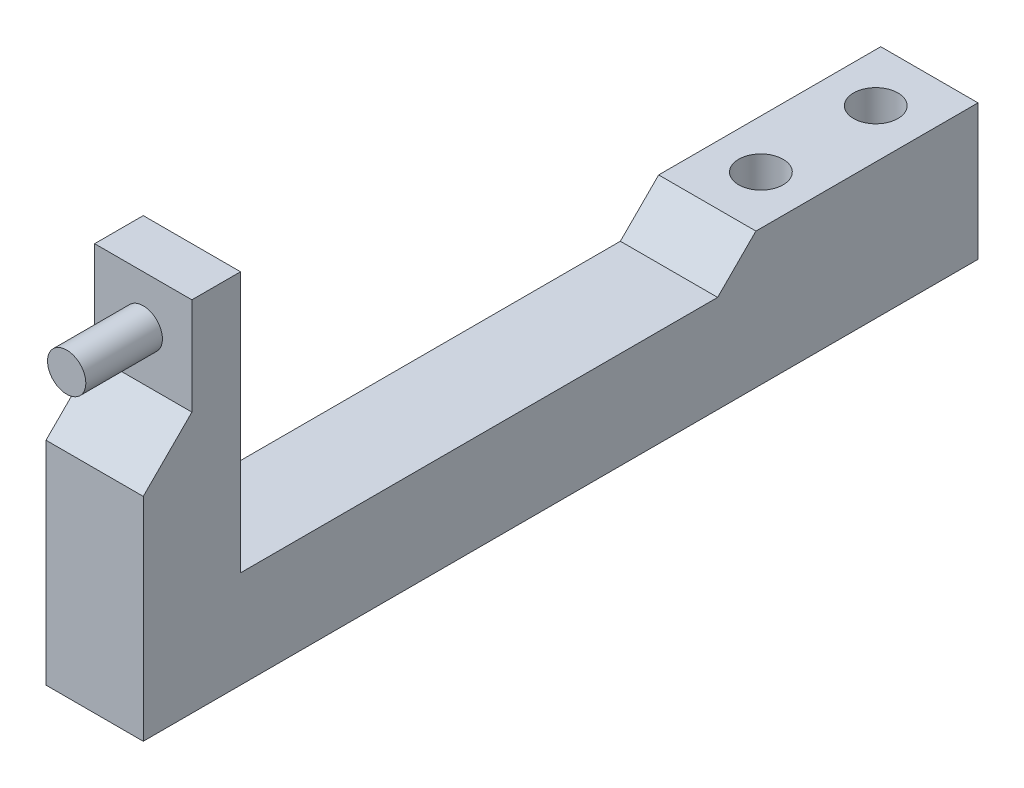
ISO-10303-21;
HEADER;
FILE_DESCRIPTION(('STEP AP214'),'2;1');
FILE_NAME('part.step','',(''),(''),'','','');
FILE_SCHEMA(('AUTOMOTIVE_DESIGN { 1 0 10303 214 1 1 1 1 }'));
ENDSEC;
DATA;
#1=APPLICATION_CONTEXT('core data for automotive mechanical design processes');
#2=APPLICATION_PROTOCOL_DEFINITION('international standard','automotive_design',2000,#1);
#3=PRODUCT_CONTEXT('',#1,'mechanical');
#4=PRODUCT('Part','Part','',(#3));
#5=PRODUCT_RELATED_PRODUCT_CATEGORY('part','',(#4));
#6=PRODUCT_DEFINITION_FORMATION('','',#4);
#7=PRODUCT_DEFINITION_CONTEXT('part definition',#1,'design');
#8=PRODUCT_DEFINITION('design','',#6,#7);
#9=PRODUCT_DEFINITION_SHAPE('','',#8);
#10=(LENGTH_UNIT() NAMED_UNIT(*) SI_UNIT(.MILLI.,.METRE.));
#11=(NAMED_UNIT(*) PLANE_ANGLE_UNIT() SI_UNIT($,.RADIAN.));
#12=(NAMED_UNIT(*) SI_UNIT($,.STERADIAN.) SOLID_ANGLE_UNIT());
#13=UNCERTAINTY_MEASURE_WITH_UNIT(LENGTH_MEASURE(1.E-05),#10,'distance_accuracy_value','');
#14=(GEOMETRIC_REPRESENTATION_CONTEXT(3) GLOBAL_UNCERTAINTY_ASSIGNED_CONTEXT((#13)) GLOBAL_UNIT_ASSIGNED_CONTEXT((#10,
#11,#12)) REPRESENTATION_CONTEXT('',''));
#15=CARTESIAN_POINT('',(0.,0.,0.));
#16=DIRECTION('',(0.,0.,1.));
#17=DIRECTION('',(1.,0.,0.));
#18=AXIS2_PLACEMENT_3D('',#15,#16,#17);
#19=CARTESIAN_POINT('',(0.,46.75,0.));
#20=DIRECTION('',(0.,-1.,0.));
#21=DIRECTION('',(0.,0.,-1.));
#22=AXIS2_PLACEMENT_3D('',#19,#20,#21);
#23=PLANE('',#22);
#24=DIRECTION('',(1.,0.,0.));
#25=VECTOR('',#24,1.);
#26=CARTESIAN_POINT('',(-6.35,46.75,48.15));
#27=LINE('',#26,#25);
#28=CARTESIAN_POINT('',(-6.35,46.75,48.15));
#29=VERTEX_POINT('',#28);
#30=CARTESIAN_POINT('',(6.35,46.75,48.15));
#31=VERTEX_POINT('',#30);
#32=EDGE_CURVE('E144',#29,#31,#27,.T.);
#33=ORIENTED_EDGE('',*,*,#32,.T.);
#34=DIRECTION('',(0.,0.,-1.));
#35=VECTOR('',#34,1.);
#36=CARTESIAN_POINT('',(6.35,46.75,54.5));
#37=LINE('',#36,#35);
#38=CARTESIAN_POINT('',(6.35,46.75,41.8));
#39=VERTEX_POINT('',#38);
#40=EDGE_CURVE('E142',#31,#39,#37,.T.);
#41=ORIENTED_EDGE('',*,*,#40,.T.);
#42=DIRECTION('',(-1.,0.,0.));
#43=VECTOR('',#42,1.);
#44=CARTESIAN_POINT('',(-6.35,46.75,41.8));
#45=LINE('',#44,#43);
#46=CARTESIAN_POINT('',(-6.35,46.75,41.8));
#47=VERTEX_POINT('',#46);
#48=EDGE_CURVE('E163',#39,#47,#45,.T.);
#49=ORIENTED_EDGE('',*,*,#48,.T.);
#50=DIRECTION('',(0.,0.,1.));
#51=VECTOR('',#50,1.);
#52=CARTESIAN_POINT('',(-6.35,46.75,54.5));
#53=LINE('',#52,#51);
#54=EDGE_CURVE('E157',#47,#29,#53,.T.);
#55=ORIENTED_EDGE('',*,*,#54,.T.);
#56=EDGE_LOOP('',(#33,#41,#49,#55));
#57=FACE_BOUND('',#56,.T.);
#58=ADVANCED_FACE('F47',(#57),#23,.F.);
#59=CARTESIAN_POINT('',(0.,12.7,0.));
#60=DIRECTION('',(0.,-1.,0.));
#61=DIRECTION('',(0.,0.,-1.));
#62=AXIS2_PLACEMENT_3D('',#59,#60,#61);
#63=PLANE('',#62);
#64=DIRECTION('',(-1.,0.,0.));
#65=VECTOR('',#64,1.);
#66=CARTESIAN_POINT('',(-6.35,12.7,41.8));
#67=LINE('',#66,#65);
#68=CARTESIAN_POINT('',(6.35,12.7,41.8));
#69=VERTEX_POINT('',#68);
#70=CARTESIAN_POINT('',(-6.35,12.7,41.8));
#71=VERTEX_POINT('',#70);
#72=EDGE_CURVE('E137',#69,#71,#67,.T.);
#73=ORIENTED_EDGE('',*,*,#72,.F.);
#74=DIRECTION('',(0.,0.,-1.));
#75=VECTOR('',#74,1.);
#76=CARTESIAN_POINT('',(6.35,12.7,54.5));
#77=LINE('',#76,#75);
#78=CARTESIAN_POINT('',(6.35,12.7,-20.5));
#79=VERTEX_POINT('',#78);
#80=EDGE_CURVE('E234',#69,#79,#77,.T.);
#81=ORIENTED_EDGE('',*,*,#80,.T.);
#82=DIRECTION('',(-1.,0.,0.));
#83=VECTOR('',#82,1.);
#84=CARTESIAN_POINT('',(-6.35,12.7,-20.5));
#85=LINE('',#84,#83);
#86=CARTESIAN_POINT('',(-6.35,12.7,-20.5));
#87=VERTEX_POINT('',#86);
#88=EDGE_CURVE('E268',#79,#87,#85,.T.);
#89=ORIENTED_EDGE('',*,*,#88,.T.);
#90=DIRECTION('',(0.,0.,1.));
#91=VECTOR('',#90,1.);
#92=CARTESIAN_POINT('',(-6.35,12.7,54.5));
#93=LINE('',#92,#91);
#94=EDGE_CURVE('E237',#87,#71,#93,.T.);
#95=ORIENTED_EDGE('',*,*,#94,.T.);
#96=EDGE_LOOP('',(#73,#81,#89,#95));
#97=FACE_BOUND('',#96,.T.);
#98=ADVANCED_FACE('F306',(#97),#63,.F.);
#99=CARTESIAN_POINT('',(6.35,12.7,54.5));
#100=DIRECTION('',(-1.,0.,0.));
#101=DIRECTION('',(0.,0.,1.));
#102=AXIS2_PLACEMENT_3D('',#99,#100,#101);
#103=PLANE('',#102);
#104=DIRECTION('',(0.,-1.,0.));
#105=VECTOR('',#104,1.);
#106=CARTESIAN_POINT('',(6.35,46.75,48.15));
#107=LINE('',#106,#105);
#108=CARTESIAN_POINT('',(6.35,34.05,48.15));
#109=VERTEX_POINT('',#108);
#110=EDGE_CURVE('E132',#31,#109,#107,.T.);
#111=ORIENTED_EDGE('',*,*,#110,.T.);
#112=DIRECTION('',(0.,0.707106781186548,-0.707106781186547));
#113=VECTOR('',#112,1.);
#114=CARTESIAN_POINT('',(6.35,34.05,48.15));
#115=LINE('',#114,#113);
#116=CARTESIAN_POINT('',(6.35,27.7,54.5));
#117=VERTEX_POINT('',#116);
#118=EDGE_CURVE('E71',#109,#117,#115,.F.);
#119=ORIENTED_EDGE('',*,*,#118,.T.);
#120=DIRECTION('',(0.,-1.,0.));
#121=VECTOR('',#120,1.);
#122=CARTESIAN_POINT('',(6.35,12.7,54.5));
#123=LINE('',#122,#121);
#124=CARTESIAN_POINT('',(6.35,0.,54.5));
#125=VERTEX_POINT('',#124);
#126=EDGE_CURVE('E241',#117,#125,#123,.T.);
#127=ORIENTED_EDGE('',*,*,#126,.T.);
#128=DIRECTION('',(0.,0.,-1.));
#129=VECTOR('',#128,1.);
#130=CARTESIAN_POINT('',(6.35,0.,54.5));
#131=LINE('',#130,#129);
#132=CARTESIAN_POINT('',(6.35,0.,-54.5));
#133=VERTEX_POINT('',#132);
#134=EDGE_CURVE('E233',#125,#133,#131,.T.);
#135=ORIENTED_EDGE('',*,*,#134,.T.);
#136=DIRECTION('',(0.,-1.,0.));
#137=VECTOR('',#136,1.);
#138=CARTESIAN_POINT('',(6.35,12.7,-54.5));
#139=LINE('',#138,#137);
#140=CARTESIAN_POINT('',(6.34999999999994,17.7,-54.5));
#141=VERTEX_POINT('',#140);
#142=EDGE_CURVE('E264',#141,#133,#139,.T.);
#143=ORIENTED_EDGE('',*,*,#142,.F.);
#144=DIRECTION('',(0.,0.,-1.));
#145=VECTOR('',#144,1.);
#146=CARTESIAN_POINT('',(6.34999999999994,17.7,-54.5));
#147=LINE('',#146,#145);
#148=CARTESIAN_POINT('',(6.34999999999995,17.7,-25.5));
#149=VERTEX_POINT('',#148);
#150=EDGE_CURVE('E225',#149,#141,#147,.T.);
#151=ORIENTED_EDGE('',*,*,#150,.F.);
#152=DIRECTION('',(0.,0.707106781186551,-0.707106781186544));
#153=VECTOR('',#152,1.);
#154=CARTESIAN_POINT('',(6.35,-24.8,16.9999999999997));
#155=LINE('',#154,#153);
#156=EDGE_CURVE('E271',#149,#79,#155,.F.);
#157=ORIENTED_EDGE('',*,*,#156,.T.);
#158=ORIENTED_EDGE('',*,*,#80,.F.);
#159=DIRECTION('',(0.,-1.,0.));
#160=VECTOR('',#159,1.);
#161=CARTESIAN_POINT('',(6.35,46.75,41.8));
#162=LINE('',#161,#160);
#163=EDGE_CURVE('E173',#39,#69,#162,.T.);
#164=ORIENTED_EDGE('',*,*,#163,.F.);
#165=ORIENTED_EDGE('',*,*,#40,.F.);
#166=EDGE_LOOP('',(#111,#119,#127,#135,#143,#151,#157,#158,#164,#165));
#167=FACE_BOUND('',#166,.T.);
#168=ADVANCED_FACE('F140',(#167),#103,.F.);
#169=CARTESIAN_POINT('',(-6.35,12.7,-54.5));
#170=DIRECTION('',(0.,0.,1.));
#171=DIRECTION('',(1.,0.,0.));
#172=AXIS2_PLACEMENT_3D('',#169,#170,#171);
#173=PLANE('',#172);
#174=DIRECTION('',(-1.,0.,0.));
#175=VECTOR('',#174,1.);
#176=CARTESIAN_POINT('',(-6.35,0.,-54.5));
#177=LINE('',#176,#175);
#178=CARTESIAN_POINT('',(-6.35,0.,-54.5));
#179=VERTEX_POINT('',#178);
#180=EDGE_CURVE('E245',#133,#179,#177,.T.);
#181=ORIENTED_EDGE('',*,*,#180,.T.);
#182=DIRECTION('',(0.,-1.,0.));
#183=VECTOR('',#182,1.);
#184=CARTESIAN_POINT('',(-6.35,12.7,-54.5));
#185=LINE('',#184,#183);
#186=CARTESIAN_POINT('',(-6.34999999999994,17.7,-54.5));
#187=VERTEX_POINT('',#186);
#188=EDGE_CURVE('E260',#187,#179,#185,.T.);
#189=ORIENTED_EDGE('',*,*,#188,.F.);
#190=DIRECTION('',(-1.,0.,0.));
#191=VECTOR('',#190,1.);
#192=CARTESIAN_POINT('',(-6.34999999999994,17.7,-54.5));
#193=LINE('',#192,#191);
#194=EDGE_CURVE('E229',#141,#187,#193,.T.);
#195=ORIENTED_EDGE('',*,*,#194,.F.);
#196=ORIENTED_EDGE('',*,*,#142,.T.);
#197=EDGE_LOOP('',(#181,#189,#195,#196));
#198=FACE_BOUND('',#197,.T.);
#199=ADVANCED_FACE('F292',(#198),#173,.F.);
#200=CARTESIAN_POINT('',(-6.35,12.7,54.5));
#201=DIRECTION('',(1.,0.,0.));
#202=DIRECTION('',(0.,0.,-1.));
#203=AXIS2_PLACEMENT_3D('',#200,#201,#202);
#204=PLANE('',#203);
#205=DIRECTION('',(0.,-1.,0.));
#206=VECTOR('',#205,1.);
#207=CARTESIAN_POINT('',(-6.35,12.7,54.5));
#208=LINE('',#207,#206);
#209=CARTESIAN_POINT('',(-6.35,27.7,54.5));
#210=VERTEX_POINT('',#209);
#211=CARTESIAN_POINT('',(-6.35,0.,54.5));
#212=VERTEX_POINT('',#211);
#213=EDGE_CURVE('E257',#210,#212,#208,.T.);
#214=ORIENTED_EDGE('',*,*,#213,.F.);
#215=DIRECTION('',(0.,-0.707106781186548,0.707106781186547));
#216=VECTOR('',#215,1.);
#217=CARTESIAN_POINT('',(-6.35,34.05,48.15));
#218=LINE('',#217,#216);
#219=CARTESIAN_POINT('',(-6.35,34.05,48.15));
#220=VERTEX_POINT('',#219);
#221=EDGE_CURVE('E12',#210,#220,#218,.F.);
#222=ORIENTED_EDGE('',*,*,#221,.T.);
#223=DIRECTION('',(0.,1.,0.));
#224=VECTOR('',#223,1.);
#225=CARTESIAN_POINT('',(-6.35,46.75,48.15));
#226=LINE('',#225,#224);
#227=EDGE_CURVE('E135',#220,#29,#226,.T.);
#228=ORIENTED_EDGE('',*,*,#227,.T.);
#229=ORIENTED_EDGE('',*,*,#54,.F.);
#230=DIRECTION('',(0.,-1.,0.));
#231=VECTOR('',#230,1.);
#232=CARTESIAN_POINT('',(-6.35,46.75,41.8));
#233=LINE('',#232,#231);
#234=EDGE_CURVE('E166',#47,#71,#233,.T.);
#235=ORIENTED_EDGE('',*,*,#234,.T.);
#236=ORIENTED_EDGE('',*,*,#94,.F.);
#237=DIRECTION('',(0.,-0.707106781186551,0.707106781186544));
#238=VECTOR('',#237,1.);
#239=CARTESIAN_POINT('',(-6.35,-24.8,16.9999999999997));
#240=LINE('',#239,#238);
#241=CARTESIAN_POINT('',(-6.35000000000005,17.7,-25.5));
#242=VERTEX_POINT('',#241);
#243=EDGE_CURVE('E127',#87,#242,#240,.F.);
#244=ORIENTED_EDGE('',*,*,#243,.T.);
#245=DIRECTION('',(0.,0.,1.));
#246=VECTOR('',#245,1.);
#247=CARTESIAN_POINT('',(-6.34999999999994,17.7,-54.5));
#248=LINE('',#247,#246);
#249=EDGE_CURVE('E217',#187,#242,#248,.T.);
#250=ORIENTED_EDGE('',*,*,#249,.F.);
#251=ORIENTED_EDGE('',*,*,#188,.T.);
#252=DIRECTION('',(0.,0.,1.));
#253=VECTOR('',#252,1.);
#254=CARTESIAN_POINT('',(-6.35,0.,54.5));
#255=LINE('',#254,#253);
#256=EDGE_CURVE('E248',#179,#212,#255,.T.);
#257=ORIENTED_EDGE('',*,*,#256,.T.);
#258=EDGE_LOOP('',(#214,#222,#228,#229,#235,#236,#244,#250,#251,#257));
#259=FACE_BOUND('',#258,.T.);
#260=ADVANCED_FACE('F281',(#259),#204,.F.);
#261=CARTESIAN_POINT('',(-6.35,12.7,54.5));
#262=DIRECTION('',(0.,0.,-1.));
#263=DIRECTION('',(-1.,0.,0.));
#264=AXIS2_PLACEMENT_3D('',#261,#262,#263);
#265=PLANE('',#264);
#266=ORIENTED_EDGE('',*,*,#126,.F.);
#267=DIRECTION('',(-1.,0.,0.));
#268=VECTOR('',#267,1.);
#269=CARTESIAN_POINT('',(-6.35,27.7,54.5));
#270=LINE('',#269,#268);
#271=EDGE_CURVE('E57',#117,#210,#270,.T.);
#272=ORIENTED_EDGE('',*,*,#271,.T.);
#273=ORIENTED_EDGE('',*,*,#213,.T.);
#274=DIRECTION('',(1.,0.,0.));
#275=VECTOR('',#274,1.);
#276=CARTESIAN_POINT('',(-6.35,0.,54.5));
#277=LINE('',#276,#275);
#278=EDGE_CURVE('E238',#212,#125,#277,.T.);
#279=ORIENTED_EDGE('',*,*,#278,.T.);
#280=EDGE_LOOP('',(#266,#272,#273,#279));
#281=FACE_BOUND('',#280,.T.);
#282=ADVANCED_FACE('F298',(#281),#265,.F.);
#283=CARTESIAN_POINT('',(0.,0.,0.));
#284=DIRECTION('',(0.,-1.,0.));
#285=DIRECTION('',(0.,0.,-1.));
#286=AXIS2_PLACEMENT_3D('',#283,#284,#285);
#287=PLANE('',#286);
#288=CARTESIAN_POINT('',(0.,0.,-47.5));
#289=DIRECTION('',(0.,-1.,0.));
#290=DIRECTION('',(0.,0.,-1.));
#291=AXIS2_PLACEMENT_3D('',#288,#289,#290);
#292=CIRCLE('',#291,5.025);
#293=CARTESIAN_POINT('',(0.,0.,-52.525));
#294=VERTEX_POINT('',#293);
#295=EDGE_CURVE('E177',#294,#294,#292,.T.);
#296=ORIENTED_EDGE('',*,*,#295,.F.);
#297=EDGE_LOOP('',(#296));
#298=FACE_BOUND('',#297,.T.);
#299=CARTESIAN_POINT('',(0.,0.,-32.5));
#300=DIRECTION('',(0.,-1.,0.));
#301=DIRECTION('',(0.,0.,-1.));
#302=AXIS2_PLACEMENT_3D('',#299,#300,#301);
#303=CIRCLE('',#302,5.025);
#304=CARTESIAN_POINT('',(0.,0.,-37.525));
#305=VERTEX_POINT('',#304);
#306=EDGE_CURVE('E197',#305,#305,#303,.T.);
#307=ORIENTED_EDGE('',*,*,#306,.F.);
#308=EDGE_LOOP('',(#307));
#309=FACE_BOUND('',#308,.T.);
#310=ORIENTED_EDGE('',*,*,#134,.F.);
#311=ORIENTED_EDGE('',*,*,#278,.F.);
#312=ORIENTED_EDGE('',*,*,#256,.F.);
#313=ORIENTED_EDGE('',*,*,#180,.F.);
#314=EDGE_LOOP('',(#310,#311,#312,#313));
#315=FACE_BOUND('',#314,.T.);
#316=ADVANCED_FACE('F297',(#298,#309,#315),#287,.T.);
#317=CARTESIAN_POINT('',(0.,17.7,0.));
#318=DIRECTION('',(0.,1.,0.));
#319=DIRECTION('',(0.,0.,1.));
#320=AXIS2_PLACEMENT_3D('',#317,#318,#319);
#321=PLANE('',#320);
#322=CARTESIAN_POINT('',(0.,17.7,-47.5));
#323=DIRECTION('',(0.,-1.,0.));
#324=DIRECTION('',(0.,0.,-1.));
#325=AXIS2_PLACEMENT_3D('',#322,#323,#324);
#326=CIRCLE('',#325,2.9);
#327=CARTESIAN_POINT('',(0.,17.7,-50.4));
#328=VERTEX_POINT('',#327);
#329=EDGE_CURVE('E193',#328,#328,#326,.T.);
#330=ORIENTED_EDGE('',*,*,#329,.T.);
#331=EDGE_LOOP('',(#330));
#332=FACE_BOUND('',#331,.T.);
#333=CARTESIAN_POINT('',(0.,17.7,-32.5));
#334=DIRECTION('',(0.,-1.,0.));
#335=DIRECTION('',(0.,0.,-1.));
#336=AXIS2_PLACEMENT_3D('',#333,#334,#335);
#337=CIRCLE('',#336,2.9);
#338=CARTESIAN_POINT('',(0.,17.7,-35.4));
#339=VERTEX_POINT('',#338);
#340=EDGE_CURVE('E213',#339,#339,#337,.T.);
#341=ORIENTED_EDGE('',*,*,#340,.T.);
#342=EDGE_LOOP('',(#341));
#343=FACE_BOUND('',#342,.T.);
#344=ORIENTED_EDGE('',*,*,#249,.T.);
#345=DIRECTION('',(1.,0.,0.));
#346=VECTOR('',#345,1.);
#347=CARTESIAN_POINT('',(-6.35000000000005,17.7,-25.5));
#348=LINE('',#347,#346);
#349=EDGE_CURVE('E221',#242,#149,#348,.T.);
#350=ORIENTED_EDGE('',*,*,#349,.T.);
#351=ORIENTED_EDGE('',*,*,#150,.T.);
#352=ORIENTED_EDGE('',*,*,#194,.T.);
#353=EDGE_LOOP('',(#344,#350,#351,#352));
#354=FACE_BOUND('',#353,.T.);
#355=ADVANCED_FACE('F286',(#332,#343,#354),#321,.T.);
#356=CARTESIAN_POINT('',(0.,0.,-32.5));
#357=DIRECTION('',(0.,-1.,0.));
#358=DIRECTION('',(0.,0.,-1.));
#359=AXIS2_PLACEMENT_3D('',#356,#357,#358);
#360=CYLINDRICAL_SURFACE('',#359,2.9);
#361=ORIENTED_EDGE('',*,*,#340,.F.);
#362=EDGE_LOOP('',(#361));
#363=FACE_BOUND('',#362,.T.);
#364=CARTESIAN_POINT('',(0.,5.,-32.5));
#365=DIRECTION('',(0.,-1.,0.));
#366=DIRECTION('',(0.,0.,-1.));
#367=AXIS2_PLACEMENT_3D('',#364,#365,#366);
#368=CIRCLE('',#367,2.9);
#369=CARTESIAN_POINT('',(0.,5.,-35.4));
#370=VERTEX_POINT('',#369);
#371=EDGE_CURVE('E209',#370,#370,#368,.T.);
#372=ORIENTED_EDGE('',*,*,#371,.T.);
#373=EDGE_LOOP('',(#372));
#374=FACE_BOUND('',#373,.T.);
#375=ADVANCED_FACE('F365',(#363,#374),#360,.F.);
#376=CARTESIAN_POINT('',(5.,5.,-32.5));
#377=DIRECTION('',(0.,1.,0.));
#378=DIRECTION('',(0.,0.,1.));
#379=AXIS2_PLACEMENT_3D('',#376,#377,#378);
#380=PLANE('',#379);
#381=ORIENTED_EDGE('',*,*,#371,.F.);
#382=EDGE_LOOP('',(#381));
#383=FACE_BOUND('',#382,.T.);
#384=CARTESIAN_POINT('',(0.,5.,-32.5));
#385=DIRECTION('',(0.,-1.,0.));
#386=DIRECTION('',(0.,0.,-1.));
#387=AXIS2_PLACEMENT_3D('',#384,#385,#386);
#388=CIRCLE('',#387,5.);
#389=CARTESIAN_POINT('',(0.,5.,-37.5));
#390=VERTEX_POINT('',#389);
#391=EDGE_CURVE('E205',#390,#390,#388,.T.);
#392=ORIENTED_EDGE('',*,*,#391,.T.);
#393=EDGE_LOOP('',(#392));
#394=FACE_BOUND('',#393,.T.);
#395=ADVANCED_FACE('F362',(#383,#394),#380,.F.);
#396=CARTESIAN_POINT('',(0.,0.,-32.5));
#397=DIRECTION('',(0.,-1.,0.));
#398=DIRECTION('',(0.,0.,-1.));
#399=AXIS2_PLACEMENT_3D('',#396,#397,#398);
#400=CYLINDRICAL_SURFACE('',#399,5.);
#401=ORIENTED_EDGE('',*,*,#391,.F.);
#402=EDGE_LOOP('',(#401));
#403=FACE_BOUND('',#402,.T.);
#404=CARTESIAN_POINT('',(0.,0.0209774907794336,-32.5));
#405=DIRECTION('',(0.,-1.,0.));
#406=DIRECTION('',(0.,0.,-1.));
#407=AXIS2_PLACEMENT_3D('',#404,#405,#406);
#408=CIRCLE('',#407,5.);
#409=CARTESIAN_POINT('',(0.,0.0209774907794336,-37.5));
#410=VERTEX_POINT('',#409);
#411=EDGE_CURVE('E201',#410,#410,#408,.T.);
#412=ORIENTED_EDGE('',*,*,#411,.T.);
#413=EDGE_LOOP('',(#412));
#414=FACE_BOUND('',#413,.T.);
#415=ADVANCED_FACE('F358',(#403,#414),#400,.F.);
#416=CARTESIAN_POINT('',(0.,0.,-32.5));
#417=DIRECTION('',(0.,-1.,0.));
#418=DIRECTION('',(0.,0.,-1.));
#419=AXIS2_PLACEMENT_3D('',#416,#417,#418);
#420=CONICAL_SURFACE('',#419,5.025,0.872664625997159);
#421=ORIENTED_EDGE('',*,*,#411,.F.);
#422=EDGE_LOOP('',(#421));
#423=FACE_BOUND('',#422,.T.);
#424=ORIENTED_EDGE('',*,*,#306,.T.);
#425=EDGE_LOOP('',(#424));
#426=FACE_BOUND('',#425,.T.);
#427=ADVANCED_FACE('F354',(#423,#426),#420,.F.);
#428=CARTESIAN_POINT('',(0.,0.,-47.5));
#429=DIRECTION('',(0.,-1.,0.));
#430=DIRECTION('',(0.,0.,-1.));
#431=AXIS2_PLACEMENT_3D('',#428,#429,#430);
#432=CYLINDRICAL_SURFACE('',#431,2.9);
#433=ORIENTED_EDGE('',*,*,#329,.F.);
#434=EDGE_LOOP('',(#433));
#435=FACE_BOUND('',#434,.T.);
#436=CARTESIAN_POINT('',(0.,5.,-47.5));
#437=DIRECTION('',(0.,-1.,0.));
#438=DIRECTION('',(0.,0.,-1.));
#439=AXIS2_PLACEMENT_3D('',#436,#437,#438);
#440=CIRCLE('',#439,2.9);
#441=CARTESIAN_POINT('',(0.,5.,-50.4));
#442=VERTEX_POINT('',#441);
#443=EDGE_CURVE('E189',#442,#442,#440,.T.);
#444=ORIENTED_EDGE('',*,*,#443,.T.);
#445=EDGE_LOOP('',(#444));
#446=FACE_BOUND('',#445,.T.);
#447=ADVANCED_FACE('F350',(#435,#446),#432,.F.);
#448=CARTESIAN_POINT('',(5.,5.,-47.5));
#449=DIRECTION('',(0.,1.,0.));
#450=DIRECTION('',(0.,0.,1.));
#451=AXIS2_PLACEMENT_3D('',#448,#449,#450);
#452=PLANE('',#451);
#453=ORIENTED_EDGE('',*,*,#443,.F.);
#454=EDGE_LOOP('',(#453));
#455=FACE_BOUND('',#454,.T.);
#456=CARTESIAN_POINT('',(0.,5.,-47.5));
#457=DIRECTION('',(0.,-1.,0.));
#458=DIRECTION('',(0.,0.,-1.));
#459=AXIS2_PLACEMENT_3D('',#456,#457,#458);
#460=CIRCLE('',#459,5.);
#461=CARTESIAN_POINT('',(0.,5.,-52.5));
#462=VERTEX_POINT('',#461);
#463=EDGE_CURVE('E185',#462,#462,#460,.T.);
#464=ORIENTED_EDGE('',*,*,#463,.T.);
#465=EDGE_LOOP('',(#464));
#466=FACE_BOUND('',#465,.T.);
#467=ADVANCED_FACE('F342',(#455,#466),#452,.F.);
#468=CARTESIAN_POINT('',(0.,0.,-47.5));
#469=DIRECTION('',(0.,-1.,0.));
#470=DIRECTION('',(0.,0.,-1.));
#471=AXIS2_PLACEMENT_3D('',#468,#469,#470);
#472=CYLINDRICAL_SURFACE('',#471,5.);
#473=ORIENTED_EDGE('',*,*,#463,.F.);
#474=EDGE_LOOP('',(#473));
#475=FACE_BOUND('',#474,.T.);
#476=CARTESIAN_POINT('',(0.,0.0209774907794336,-47.5));
#477=DIRECTION('',(0.,-1.,0.));
#478=DIRECTION('',(0.,0.,-1.));
#479=AXIS2_PLACEMENT_3D('',#476,#477,#478);
#480=CIRCLE('',#479,5.);
#481=CARTESIAN_POINT('',(0.,0.0209774907794336,-52.5));
#482=VERTEX_POINT('',#481);
#483=EDGE_CURVE('E181',#482,#482,#480,.T.);
#484=ORIENTED_EDGE('',*,*,#483,.T.);
#485=EDGE_LOOP('',(#484));
#486=FACE_BOUND('',#485,.T.);
#487=ADVANCED_FACE('F336',(#475,#486),#472,.F.);
#488=CARTESIAN_POINT('',(0.,0.,-47.5));
#489=DIRECTION('',(0.,-1.,0.));
#490=DIRECTION('',(0.,0.,-1.));
#491=AXIS2_PLACEMENT_3D('',#488,#489,#490);
#492=CONICAL_SURFACE('',#491,5.025,0.872664625997159);
#493=ORIENTED_EDGE('',*,*,#483,.F.);
#494=EDGE_LOOP('',(#493));
#495=FACE_BOUND('',#494,.T.);
#496=ORIENTED_EDGE('',*,*,#295,.T.);
#497=EDGE_LOOP('',(#496));
#498=FACE_BOUND('',#497,.T.);
#499=ADVANCED_FACE('F330',(#495,#498),#492,.F.);
#500=CARTESIAN_POINT('',(-6.35000000000005,17.7,-25.5));
#501=DIRECTION('',(0.,0.707106781186544,0.707106781186551));
#502=DIRECTION('',(-1.,0.,0.));
#503=AXIS2_PLACEMENT_3D('',#500,#501,#502);
#504=PLANE('',#503);
#505=ORIENTED_EDGE('',*,*,#243,.F.);
#506=ORIENTED_EDGE('',*,*,#88,.F.);
#507=ORIENTED_EDGE('',*,*,#156,.F.);
#508=ORIENTED_EDGE('',*,*,#349,.F.);
#509=EDGE_LOOP('',(#505,#506,#507,#508));
#510=FACE_BOUND('',#509,.T.);
#511=ADVANCED_FACE('F289',(#510),#504,.T.);
#512=CARTESIAN_POINT('',(-6.35,46.75,41.8));
#513=DIRECTION('',(0.,0.,1.));
#514=DIRECTION('',(1.,0.,0.));
#515=AXIS2_PLACEMENT_3D('',#512,#513,#514);
#516=PLANE('',#515);
#517=ORIENTED_EDGE('',*,*,#72,.T.);
#518=ORIENTED_EDGE('',*,*,#234,.F.);
#519=ORIENTED_EDGE('',*,*,#48,.F.);
#520=ORIENTED_EDGE('',*,*,#163,.T.);
#521=EDGE_LOOP('',(#517,#518,#519,#520));
#522=FACE_BOUND('',#521,.T.);
#523=ADVANCED_FACE('F304',(#522),#516,.F.);
#524=CARTESIAN_POINT('',(-6.35,46.75,48.15));
#525=DIRECTION('',(0.,0.,1.));
#526=DIRECTION('',(1.,0.,0.));
#527=AXIS2_PLACEMENT_3D('',#524,#525,#526);
#528=PLANE('',#527);
#529=CARTESIAN_POINT('',(0.,40.4,48.15));
#530=DIRECTION('',(0.,0.,1.));
#531=DIRECTION('',(1.,0.,0.));
#532=AXIS2_PLACEMENT_3D('',#529,#530,#531);
#533=CIRCLE('',#532,2.5);
#534=CARTESIAN_POINT('',(2.5,40.4,48.15));
#535=VERTEX_POINT('',#534);
#536=EDGE_CURVE('E151',#535,#535,#533,.T.);
#537=ORIENTED_EDGE('',*,*,#536,.F.);
#538=EDGE_LOOP('',(#537));
#539=FACE_BOUND('',#538,.T.);
#540=ORIENTED_EDGE('',*,*,#227,.F.);
#541=DIRECTION('',(-1.,0.,0.));
#542=VECTOR('',#541,1.);
#543=CARTESIAN_POINT('',(-6.35,34.05,48.15));
#544=LINE('',#543,#542);
#545=EDGE_CURVE('E125',#109,#220,#544,.T.);
#546=ORIENTED_EDGE('',*,*,#545,.F.);
#547=ORIENTED_EDGE('',*,*,#110,.F.);
#548=ORIENTED_EDGE('',*,*,#32,.F.);
#549=EDGE_LOOP('',(#540,#546,#547,#548));
#550=FACE_BOUND('',#549,.T.);
#551=ADVANCED_FACE('F131',(#539,#550),#528,.T.);
#552=CARTESIAN_POINT('',(0.,40.4,58.15));
#553=DIRECTION('',(0.,0.,-1.));
#554=DIRECTION('',(-1.,0.,0.));
#555=AXIS2_PLACEMENT_3D('',#552,#553,#554);
#556=CYLINDRICAL_SURFACE('',#555,2.5);
#557=CARTESIAN_POINT('',(0.,40.4,58.15));
#558=DIRECTION('',(0.,0.,1.));
#559=DIRECTION('',(1.,0.,0.));
#560=AXIS2_PLACEMENT_3D('',#557,#558,#559);
#561=CIRCLE('',#560,2.5);
#562=CARTESIAN_POINT('',(2.5,40.4,58.15));
#563=VERTEX_POINT('',#562);
#564=EDGE_CURVE('E145',#563,#563,#561,.T.);
#565=ORIENTED_EDGE('',*,*,#564,.F.);
#566=EDGE_LOOP('',(#565));
#567=FACE_BOUND('',#566,.T.);
#568=ORIENTED_EDGE('',*,*,#536,.T.);
#569=EDGE_LOOP('',(#568));
#570=FACE_BOUND('',#569,.T.);
#571=ADVANCED_FACE('F425',(#567,#570),#556,.T.);
#572=CARTESIAN_POINT('',(0.,40.4,58.15));
#573=DIRECTION('',(0.,0.,1.));
#574=DIRECTION('',(1.,0.,0.));
#575=AXIS2_PLACEMENT_3D('',#572,#573,#574);
#576=PLANE('',#575);
#577=ORIENTED_EDGE('',*,*,#564,.T.);
#578=EDGE_LOOP('',(#577));
#579=FACE_BOUND('',#578,.T.);
#580=ADVANCED_FACE('F420',(#579),#576,.T.);
#581=CARTESIAN_POINT('',(-6.35,34.05,48.15));
#582=DIRECTION('',(0.,-0.707106781186547,-0.707106781186548));
#583=DIRECTION('',(1.,0.,0.));
#584=AXIS2_PLACEMENT_3D('',#581,#582,#583);
#585=PLANE('',#584);
#586=ORIENTED_EDGE('',*,*,#221,.F.);
#587=ORIENTED_EDGE('',*,*,#271,.F.);
#588=ORIENTED_EDGE('',*,*,#118,.F.);
#589=ORIENTED_EDGE('',*,*,#545,.T.);
#590=EDGE_LOOP('',(#586,#587,#588,#589));
#591=FACE_BOUND('',#590,.T.);
#592=ADVANCED_FACE('F50',(#591),#585,.F.);
#593=CLOSED_SHELL('',(#58,#98,#168,#199,#260,#282,#316,#355,#375,#395,#415,#427,#447,#467,#487,
#499,#511,#523,#551,#571,#580,#592));
#594=MANIFOLD_SOLID_BREP('B2',#593);
#595=ADVANCED_BREP_SHAPE_REPRESENTATION('',(#18,#594),#14);
#596=SHAPE_DEFINITION_REPRESENTATION(#9,#595);
ENDSEC;
END-ISO-10303-21;
